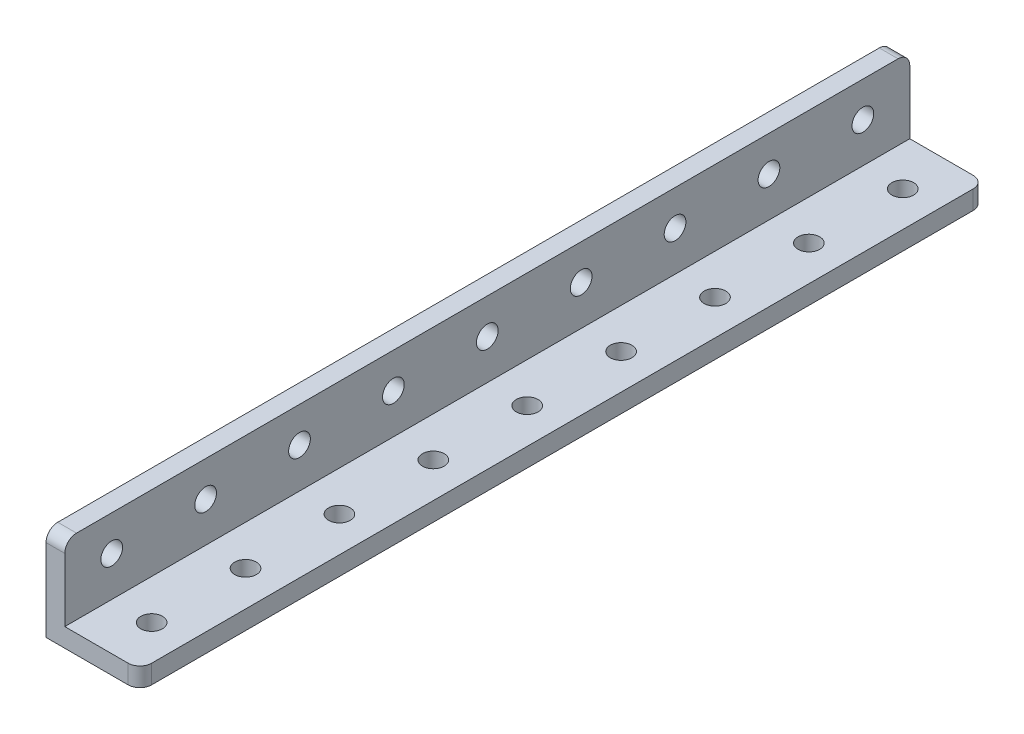
ISO-10303-21;
HEADER;
FILE_DESCRIPTION(('STEP AP214'),'2;1');
FILE_NAME('part.step','',(''),(''),'','','');
FILE_SCHEMA(('AUTOMOTIVE_DESIGN { 1 0 10303 214 1 1 1 1 }'));
ENDSEC;
DATA;
#1=APPLICATION_CONTEXT('core data for automotive mechanical design processes');
#2=APPLICATION_PROTOCOL_DEFINITION('international standard','automotive_design',2000,#1);
#3=PRODUCT_CONTEXT('',#1,'mechanical');
#4=PRODUCT('Part','Part','',(#3));
#5=PRODUCT_RELATED_PRODUCT_CATEGORY('part','',(#4));
#6=PRODUCT_DEFINITION_FORMATION('','',#4);
#7=PRODUCT_DEFINITION_CONTEXT('part definition',#1,'design');
#8=PRODUCT_DEFINITION('design','',#6,#7);
#9=PRODUCT_DEFINITION_SHAPE('','',#8);
#10=(LENGTH_UNIT() NAMED_UNIT(*) SI_UNIT(.MILLI.,.METRE.));
#11=(NAMED_UNIT(*) PLANE_ANGLE_UNIT() SI_UNIT($,.RADIAN.));
#12=(NAMED_UNIT(*) SI_UNIT($,.STERADIAN.) SOLID_ANGLE_UNIT());
#13=UNCERTAINTY_MEASURE_WITH_UNIT(LENGTH_MEASURE(1.E-05),#10,'distance_accuracy_value','');
#14=(GEOMETRIC_REPRESENTATION_CONTEXT(3) GLOBAL_UNCERTAINTY_ASSIGNED_CONTEXT((#13)) GLOBAL_UNIT_ASSIGNED_CONTEXT((#10,
#11,#12)) REPRESENTATION_CONTEXT('',''));
#15=CARTESIAN_POINT('',(0.,0.,0.));
#16=DIRECTION('',(0.,0.,1.));
#17=DIRECTION('',(1.,0.,0.));
#18=AXIS2_PLACEMENT_3D('',#15,#16,#17);
#19=CARTESIAN_POINT('',(0.,16.,-72.));
#20=DIRECTION('',(-1.,0.,0.));
#21=DIRECTION('',(0.,-1.,0.));
#22=AXIS2_PLACEMENT_3D('',#19,#20,#21);
#23=PLANE('',#22);
#24=CARTESIAN_POINT('',(0.,10.,48.));
#25=DIRECTION('',(-1.,0.,0.));
#26=DIRECTION('',(0.,-1.,0.));
#27=AXIS2_PLACEMENT_3D('',#24,#25,#26);
#28=CIRCLE('',#27,1.85000000000003);
#29=CARTESIAN_POINT('',(0.,8.14999999999997,48.));
#30=VERTEX_POINT('',#29);
#31=EDGE_CURVE('E556',#30,#30,#28,.T.);
#32=ORIENTED_EDGE('',*,*,#31,.F.);
#33=EDGE_LOOP('',(#32));
#34=FACE_BOUND('',#33,.T.);
#35=CARTESIAN_POINT('',(0.,10.,64.));
#36=DIRECTION('',(-1.,0.,0.));
#37=DIRECTION('',(0.,-1.,0.));
#38=AXIS2_PLACEMENT_3D('',#35,#36,#37);
#39=CIRCLE('',#38,1.85000000000003);
#40=CARTESIAN_POINT('',(0.,8.14999999999997,64.));
#41=VERTEX_POINT('',#40);
#42=EDGE_CURVE('E163',#41,#41,#39,.T.);
#43=ORIENTED_EDGE('',*,*,#42,.F.);
#44=EDGE_LOOP('',(#43));
#45=FACE_BOUND('',#44,.T.);
#46=DIRECTION('',(0.,0.,1.));
#47=VECTOR('',#46,1.);
#48=CARTESIAN_POINT('',(0.,16.,-72.));
#49=LINE('',#48,#47);
#50=CARTESIAN_POINT('',(0.,16.,-70.));
#51=VERTEX_POINT('',#50);
#52=CARTESIAN_POINT('',(0.,16.,70.));
#53=VERTEX_POINT('',#52);
#54=EDGE_CURVE('E148',#51,#53,#49,.T.);
#55=ORIENTED_EDGE('',*,*,#54,.F.);
#56=CARTESIAN_POINT('',(0.,14.,-70.));
#57=DIRECTION('',(-1.,0.,0.));
#58=DIRECTION('',(0.,-1.,0.));
#59=AXIS2_PLACEMENT_3D('',#56,#57,#58);
#60=CIRCLE('',#59,2.);
#61=CARTESIAN_POINT('',(0.,14.,-72.));
#62=VERTEX_POINT('',#61);
#63=EDGE_CURVE('E55',#51,#62,#60,.T.);
#64=ORIENTED_EDGE('',*,*,#63,.T.);
#65=DIRECTION('',(0.,-1.,0.));
#66=VECTOR('',#65,1.);
#67=CARTESIAN_POINT('',(0.,16.,-72.));
#68=LINE('',#67,#66);
#69=CARTESIAN_POINT('',(0.,0.,-72.));
#70=VERTEX_POINT('',#69);
#71=EDGE_CURVE('E109',#62,#70,#68,.T.);
#72=ORIENTED_EDGE('',*,*,#71,.T.);
#73=DIRECTION('',(0.,0.,1.));
#74=VECTOR('',#73,1.);
#75=CARTESIAN_POINT('',(0.,0.,-72.));
#76=LINE('',#75,#74);
#77=CARTESIAN_POINT('',(0.,0.,72.));
#78=VERTEX_POINT('',#77);
#79=EDGE_CURVE('E112',#70,#78,#76,.T.);
#80=ORIENTED_EDGE('',*,*,#79,.T.);
#81=DIRECTION('',(0.,-1.,0.));
#82=VECTOR('',#81,1.);
#83=CARTESIAN_POINT('',(0.,16.,72.));
#84=LINE('',#83,#82);
#85=CARTESIAN_POINT('',(0.,14.,72.));
#86=VERTEX_POINT('',#85);
#87=EDGE_CURVE('E140',#86,#78,#84,.T.);
#88=ORIENTED_EDGE('',*,*,#87,.F.);
#89=CARTESIAN_POINT('',(0.,14.,70.));
#90=DIRECTION('',(-1.,0.,0.));
#91=DIRECTION('',(0.,-1.,0.));
#92=AXIS2_PLACEMENT_3D('',#89,#90,#91);
#93=CIRCLE('',#92,2.);
#94=EDGE_CURVE('E47',#86,#53,#93,.T.);
#95=ORIENTED_EDGE('',*,*,#94,.T.);
#96=EDGE_LOOP('',(#55,#64,#72,#80,#88,#95));
#97=FACE_BOUND('',#96,.T.);
#98=CARTESIAN_POINT('',(0.,10.,32.));
#99=DIRECTION('',(-1.,0.,0.));
#100=DIRECTION('',(0.,-1.,0.));
#101=AXIS2_PLACEMENT_3D('',#98,#99,#100);
#102=CIRCLE('',#101,1.85000000000003);
#103=CARTESIAN_POINT('',(0.,8.14999999999997,32.));
#104=VERTEX_POINT('',#103);
#105=EDGE_CURVE('E166',#104,#104,#102,.T.);
#106=ORIENTED_EDGE('',*,*,#105,.F.);
#107=EDGE_LOOP('',(#106));
#108=FACE_BOUND('',#107,.T.);
#109=CARTESIAN_POINT('',(0.,10.,16.));
#110=DIRECTION('',(-1.,0.,0.));
#111=DIRECTION('',(0.,-1.,0.));
#112=AXIS2_PLACEMENT_3D('',#109,#110,#111);
#113=CIRCLE('',#112,1.85000000000003);
#114=CARTESIAN_POINT('',(0.,8.14999999999997,16.));
#115=VERTEX_POINT('',#114);
#116=EDGE_CURVE('E172',#115,#115,#113,.T.);
#117=ORIENTED_EDGE('',*,*,#116,.F.);
#118=EDGE_LOOP('',(#117));
#119=FACE_BOUND('',#118,.T.);
#120=CARTESIAN_POINT('',(0.,10.,0.));
#121=DIRECTION('',(-1.,0.,0.));
#122=DIRECTION('',(0.,-1.,0.));
#123=AXIS2_PLACEMENT_3D('',#120,#121,#122);
#124=CIRCLE('',#123,1.85000000000003);
#125=CARTESIAN_POINT('',(0.,8.14999999999997,0.));
#126=VERTEX_POINT('',#125);
#127=EDGE_CURVE('E178',#126,#126,#124,.T.);
#128=ORIENTED_EDGE('',*,*,#127,.F.);
#129=EDGE_LOOP('',(#128));
#130=FACE_BOUND('',#129,.T.);
#131=CARTESIAN_POINT('',(0.,10.,-16.));
#132=DIRECTION('',(-1.,0.,0.));
#133=DIRECTION('',(0.,-1.,0.));
#134=AXIS2_PLACEMENT_3D('',#131,#132,#133);
#135=CIRCLE('',#134,1.85000000000003);
#136=CARTESIAN_POINT('',(0.,8.14999999999997,-16.));
#137=VERTEX_POINT('',#136);
#138=EDGE_CURVE('E184',#137,#137,#135,.T.);
#139=ORIENTED_EDGE('',*,*,#138,.F.);
#140=EDGE_LOOP('',(#139));
#141=FACE_BOUND('',#140,.T.);
#142=CARTESIAN_POINT('',(0.,10.,-32.));
#143=DIRECTION('',(-1.,0.,0.));
#144=DIRECTION('',(0.,-1.,0.));
#145=AXIS2_PLACEMENT_3D('',#142,#143,#144);
#146=CIRCLE('',#145,1.85000000000003);
#147=CARTESIAN_POINT('',(0.,8.14999999999997,-32.));
#148=VERTEX_POINT('',#147);
#149=EDGE_CURVE('E190',#148,#148,#146,.T.);
#150=ORIENTED_EDGE('',*,*,#149,.F.);
#151=EDGE_LOOP('',(#150));
#152=FACE_BOUND('',#151,.T.);
#153=CARTESIAN_POINT('',(0.,10.,-48.));
#154=DIRECTION('',(-1.,0.,0.));
#155=DIRECTION('',(0.,-1.,0.));
#156=AXIS2_PLACEMENT_3D('',#153,#154,#155);
#157=CIRCLE('',#156,1.85000000000003);
#158=CARTESIAN_POINT('',(0.,8.14999999999997,-48.));
#159=VERTEX_POINT('',#158);
#160=EDGE_CURVE('E196',#159,#159,#157,.T.);
#161=ORIENTED_EDGE('',*,*,#160,.F.);
#162=EDGE_LOOP('',(#161));
#163=FACE_BOUND('',#162,.T.);
#164=CARTESIAN_POINT('',(0.,10.,-64.));
#165=DIRECTION('',(-1.,0.,0.));
#166=DIRECTION('',(0.,-1.,0.));
#167=AXIS2_PLACEMENT_3D('',#164,#165,#166);
#168=CIRCLE('',#167,1.85000000000003);
#169=CARTESIAN_POINT('',(0.,8.14999999999997,-64.));
#170=VERTEX_POINT('',#169);
#171=EDGE_CURVE('E202',#170,#170,#168,.T.);
#172=ORIENTED_EDGE('',*,*,#171,.F.);
#173=EDGE_LOOP('',(#172));
#174=FACE_BOUND('',#173,.T.);
#175=ADVANCED_FACE('F32',(#34,#45,#97,#108,#119,#130,#141,#152,#163,#174),#23,.T.);
#176=CARTESIAN_POINT('',(3.2,16.,-72.));
#177=DIRECTION('',(0.,1.,0.));
#178=DIRECTION('',(0.,0.,1.));
#179=AXIS2_PLACEMENT_3D('',#176,#177,#178);
#180=PLANE('',#179);
#181=DIRECTION('',(0.,0.,1.));
#182=VECTOR('',#181,1.);
#183=CARTESIAN_POINT('',(3.2,16.,-72.));
#184=LINE('',#183,#182);
#185=CARTESIAN_POINT('',(3.2,16.,-70.));
#186=VERTEX_POINT('',#185);
#187=CARTESIAN_POINT('',(3.2,16.,70.));
#188=VERTEX_POINT('',#187);
#189=EDGE_CURVE('E151',#186,#188,#184,.T.);
#190=ORIENTED_EDGE('',*,*,#189,.F.);
#191=DIRECTION('',(-1.,0.,0.));
#192=VECTOR('',#191,1.);
#193=CARTESIAN_POINT('',(3.2,16.,-70.));
#194=LINE('',#193,#192);
#195=EDGE_CURVE('E229',#186,#51,#194,.T.);
#196=ORIENTED_EDGE('',*,*,#195,.T.);
#197=ORIENTED_EDGE('',*,*,#54,.T.);
#198=DIRECTION('',(-1.,0.,0.));
#199=VECTOR('',#198,1.);
#200=CARTESIAN_POINT('',(3.2,16.,70.));
#201=LINE('',#200,#199);
#202=EDGE_CURVE('E227',#53,#188,#201,.F.);
#203=ORIENTED_EDGE('',*,*,#202,.T.);
#204=EDGE_LOOP('',(#190,#196,#197,#203));
#205=FACE_BOUND('',#204,.T.);
#206=ADVANCED_FACE('F246',(#205),#180,.T.);
#207=CARTESIAN_POINT('',(3.2,3.2,-72.));
#208=DIRECTION('',(1.,0.,0.));
#209=DIRECTION('',(0.,0.,-1.));
#210=AXIS2_PLACEMENT_3D('',#207,#208,#209);
#211=PLANE('',#210);
#212=CARTESIAN_POINT('',(3.2,10.,48.));
#213=DIRECTION('',(1.,0.,0.));
#214=DIRECTION('',(0.,0.,-1.));
#215=AXIS2_PLACEMENT_3D('',#212,#213,#214);
#216=CIRCLE('',#215,1.85000000000003);
#217=CARTESIAN_POINT('',(3.2,10.,46.15));
#218=VERTEX_POINT('',#217);
#219=EDGE_CURVE('E560',#218,#218,#216,.T.);
#220=ORIENTED_EDGE('',*,*,#219,.F.);
#221=EDGE_LOOP('',(#220));
#222=FACE_BOUND('',#221,.T.);
#223=CARTESIAN_POINT('',(3.2,10.,64.));
#224=DIRECTION('',(1.,0.,0.));
#225=DIRECTION('',(0.,0.,-1.));
#226=AXIS2_PLACEMENT_3D('',#223,#224,#225);
#227=CIRCLE('',#226,1.85000000000003);
#228=CARTESIAN_POINT('',(3.2,10.,62.15));
#229=VERTEX_POINT('',#228);
#230=EDGE_CURVE('E142',#229,#229,#227,.T.);
#231=ORIENTED_EDGE('',*,*,#230,.F.);
#232=EDGE_LOOP('',(#231));
#233=FACE_BOUND('',#232,.T.);
#234=DIRECTION('',(0.,1.,0.));
#235=VECTOR('',#234,1.);
#236=CARTESIAN_POINT('',(3.2,3.2,-72.));
#237=LINE('',#236,#235);
#238=CARTESIAN_POINT('',(3.2,3.2,-72.));
#239=VERTEX_POINT('',#238);
#240=CARTESIAN_POINT('',(3.2,14.,-72.));
#241=VERTEX_POINT('',#240);
#242=EDGE_CURVE('E127',#239,#241,#237,.T.);
#243=ORIENTED_EDGE('',*,*,#242,.T.);
#244=CARTESIAN_POINT('',(3.2,14.,-70.));
#245=DIRECTION('',(1.,0.,0.));
#246=DIRECTION('',(0.,0.,-1.));
#247=AXIS2_PLACEMENT_3D('',#244,#245,#246);
#248=CIRCLE('',#247,2.);
#249=EDGE_CURVE('E11',#241,#186,#248,.T.);
#250=ORIENTED_EDGE('',*,*,#249,.T.);
#251=ORIENTED_EDGE('',*,*,#189,.T.);
#252=CARTESIAN_POINT('',(3.2,14.,70.));
#253=DIRECTION('',(1.,0.,0.));
#254=DIRECTION('',(0.,0.,-1.));
#255=AXIS2_PLACEMENT_3D('',#252,#253,#254);
#256=CIRCLE('',#255,2.);
#257=CARTESIAN_POINT('',(3.2,14.,72.));
#258=VERTEX_POINT('',#257);
#259=EDGE_CURVE('E40',#188,#258,#256,.T.);
#260=ORIENTED_EDGE('',*,*,#259,.T.);
#261=DIRECTION('',(0.,1.,0.));
#262=VECTOR('',#261,1.);
#263=CARTESIAN_POINT('',(3.2,3.2,72.));
#264=LINE('',#263,#262);
#265=CARTESIAN_POINT('',(3.2,3.2,72.));
#266=VERTEX_POINT('',#265);
#267=EDGE_CURVE('E117',#266,#258,#264,.T.);
#268=ORIENTED_EDGE('',*,*,#267,.F.);
#269=DIRECTION('',(0.,0.,1.));
#270=VECTOR('',#269,1.);
#271=CARTESIAN_POINT('',(3.2,3.2,-72.));
#272=LINE('',#271,#270);
#273=EDGE_CURVE('E154',#239,#266,#272,.T.);
#274=ORIENTED_EDGE('',*,*,#273,.F.);
#275=EDGE_LOOP('',(#243,#250,#251,#260,#268,#274));
#276=FACE_BOUND('',#275,.T.);
#277=CARTESIAN_POINT('',(3.2,10.,32.));
#278=DIRECTION('',(1.,0.,0.));
#279=DIRECTION('',(0.,0.,-1.));
#280=AXIS2_PLACEMENT_3D('',#277,#278,#279);
#281=CIRCLE('',#280,1.85000000000003);
#282=CARTESIAN_POINT('',(3.2,10.,30.15));
#283=VERTEX_POINT('',#282);
#284=EDGE_CURVE('E150',#283,#283,#281,.T.);
#285=ORIENTED_EDGE('',*,*,#284,.F.);
#286=EDGE_LOOP('',(#285));
#287=FACE_BOUND('',#286,.T.);
#288=CARTESIAN_POINT('',(3.2,10.,16.));
#289=DIRECTION('',(1.,0.,0.));
#290=DIRECTION('',(0.,0.,-1.));
#291=AXIS2_PLACEMENT_3D('',#288,#289,#290);
#292=CIRCLE('',#291,1.85000000000003);
#293=CARTESIAN_POINT('',(3.2,10.,14.15));
#294=VERTEX_POINT('',#293);
#295=EDGE_CURVE('E169',#294,#294,#292,.T.);
#296=ORIENTED_EDGE('',*,*,#295,.F.);
#297=EDGE_LOOP('',(#296));
#298=FACE_BOUND('',#297,.T.);
#299=CARTESIAN_POINT('',(3.2,10.,0.));
#300=DIRECTION('',(1.,0.,0.));
#301=DIRECTION('',(0.,0.,-1.));
#302=AXIS2_PLACEMENT_3D('',#299,#300,#301);
#303=CIRCLE('',#302,1.85000000000003);
#304=CARTESIAN_POINT('',(3.2,10.,-1.85000000000002));
#305=VERTEX_POINT('',#304);
#306=EDGE_CURVE('E175',#305,#305,#303,.T.);
#307=ORIENTED_EDGE('',*,*,#306,.F.);
#308=EDGE_LOOP('',(#307));
#309=FACE_BOUND('',#308,.T.);
#310=CARTESIAN_POINT('',(3.2,10.,-16.));
#311=DIRECTION('',(1.,0.,0.));
#312=DIRECTION('',(0.,0.,-1.));
#313=AXIS2_PLACEMENT_3D('',#310,#311,#312);
#314=CIRCLE('',#313,1.85000000000003);
#315=CARTESIAN_POINT('',(3.2,10.,-17.85));
#316=VERTEX_POINT('',#315);
#317=EDGE_CURVE('E181',#316,#316,#314,.T.);
#318=ORIENTED_EDGE('',*,*,#317,.F.);
#319=EDGE_LOOP('',(#318));
#320=FACE_BOUND('',#319,.T.);
#321=CARTESIAN_POINT('',(3.2,10.,-32.));
#322=DIRECTION('',(1.,0.,0.));
#323=DIRECTION('',(0.,0.,-1.));
#324=AXIS2_PLACEMENT_3D('',#321,#322,#323);
#325=CIRCLE('',#324,1.85000000000003);
#326=CARTESIAN_POINT('',(3.2,10.,-33.85));
#327=VERTEX_POINT('',#326);
#328=EDGE_CURVE('E187',#327,#327,#325,.T.);
#329=ORIENTED_EDGE('',*,*,#328,.F.);
#330=EDGE_LOOP('',(#329));
#331=FACE_BOUND('',#330,.T.);
#332=CARTESIAN_POINT('',(3.2,10.,-48.));
#333=DIRECTION('',(1.,0.,0.));
#334=DIRECTION('',(0.,0.,-1.));
#335=AXIS2_PLACEMENT_3D('',#332,#333,#334);
#336=CIRCLE('',#335,1.85000000000003);
#337=CARTESIAN_POINT('',(3.2,10.,-49.85));
#338=VERTEX_POINT('',#337);
#339=EDGE_CURVE('E193',#338,#338,#336,.T.);
#340=ORIENTED_EDGE('',*,*,#339,.F.);
#341=EDGE_LOOP('',(#340));
#342=FACE_BOUND('',#341,.T.);
#343=CARTESIAN_POINT('',(3.2,10.,-64.));
#344=DIRECTION('',(1.,0.,0.));
#345=DIRECTION('',(0.,0.,-1.));
#346=AXIS2_PLACEMENT_3D('',#343,#344,#345);
#347=CIRCLE('',#346,1.85000000000003);
#348=CARTESIAN_POINT('',(3.2,10.,-65.85));
#349=VERTEX_POINT('',#348);
#350=EDGE_CURVE('E199',#349,#349,#347,.T.);
#351=ORIENTED_EDGE('',*,*,#350,.F.);
#352=EDGE_LOOP('',(#351));
#353=FACE_BOUND('',#352,.T.);
#354=ADVANCED_FACE('F235',(#222,#233,#276,#287,#298,#309,#320,#331,#342,#353),#211,.T.);
#355=CARTESIAN_POINT('',(16.,3.2,-72.));
#356=DIRECTION('',(0.,1.,0.));
#357=DIRECTION('',(-1.,0.,0.));
#358=AXIS2_PLACEMENT_3D('',#355,#356,#357);
#359=PLANE('',#358);
#360=CARTESIAN_POINT('',(10.,3.2,-64.));
#361=DIRECTION('',(0.,1.,0.));
#362=DIRECTION('',(-1.,0.,0.));
#363=AXIS2_PLACEMENT_3D('',#360,#361,#362);
#364=CIRCLE('',#363,1.85);
#365=CARTESIAN_POINT('',(8.15,3.2,-64.));
#366=VERTEX_POINT('',#365);
#367=EDGE_CURVE('E603',#366,#366,#364,.T.);
#368=ORIENTED_EDGE('',*,*,#367,.F.);
#369=EDGE_LOOP('',(#368));
#370=FACE_BOUND('',#369,.T.);
#371=CARTESIAN_POINT('',(10.,3.2,-48.));
#372=DIRECTION('',(0.,1.,0.));
#373=DIRECTION('',(-1.,0.,0.));
#374=AXIS2_PLACEMENT_3D('',#371,#372,#373);
#375=CIRCLE('',#374,1.85);
#376=CARTESIAN_POINT('',(8.15,3.2,-48.));
#377=VERTEX_POINT('',#376);
#378=EDGE_CURVE('E597',#377,#377,#375,.T.);
#379=ORIENTED_EDGE('',*,*,#378,.F.);
#380=EDGE_LOOP('',(#379));
#381=FACE_BOUND('',#380,.T.);
#382=CARTESIAN_POINT('',(10.,3.2,-32.));
#383=DIRECTION('',(0.,1.,0.));
#384=DIRECTION('',(-1.,0.,0.));
#385=AXIS2_PLACEMENT_3D('',#382,#383,#384);
#386=CIRCLE('',#385,1.85);
#387=CARTESIAN_POINT('',(8.15,3.2,-32.));
#388=VERTEX_POINT('',#387);
#389=EDGE_CURVE('E591',#388,#388,#386,.T.);
#390=ORIENTED_EDGE('',*,*,#389,.F.);
#391=EDGE_LOOP('',(#390));
#392=FACE_BOUND('',#391,.T.);
#393=CARTESIAN_POINT('',(10.,3.2,-16.));
#394=DIRECTION('',(0.,1.,0.));
#395=DIRECTION('',(-1.,0.,0.));
#396=AXIS2_PLACEMENT_3D('',#393,#394,#395);
#397=CIRCLE('',#396,1.85);
#398=CARTESIAN_POINT('',(8.15,3.2,-16.));
#399=VERTEX_POINT('',#398);
#400=EDGE_CURVE('E585',#399,#399,#397,.T.);
#401=ORIENTED_EDGE('',*,*,#400,.F.);
#402=EDGE_LOOP('',(#401));
#403=FACE_BOUND('',#402,.T.);
#404=CARTESIAN_POINT('',(10.,3.2,0.));
#405=DIRECTION('',(0.,1.,0.));
#406=DIRECTION('',(-1.,0.,0.));
#407=AXIS2_PLACEMENT_3D('',#404,#405,#406);
#408=CIRCLE('',#407,1.85);
#409=CARTESIAN_POINT('',(8.15,3.2,0.));
#410=VERTEX_POINT('',#409);
#411=EDGE_CURVE('E579',#410,#410,#408,.T.);
#412=ORIENTED_EDGE('',*,*,#411,.F.);
#413=EDGE_LOOP('',(#412));
#414=FACE_BOUND('',#413,.T.);
#415=CARTESIAN_POINT('',(10.,3.2,16.));
#416=DIRECTION('',(0.,1.,0.));
#417=DIRECTION('',(-1.,0.,0.));
#418=AXIS2_PLACEMENT_3D('',#415,#416,#417);
#419=CIRCLE('',#418,1.85);
#420=CARTESIAN_POINT('',(8.15,3.2,16.));
#421=VERTEX_POINT('',#420);
#422=EDGE_CURVE('E573',#421,#421,#419,.T.);
#423=ORIENTED_EDGE('',*,*,#422,.F.);
#424=EDGE_LOOP('',(#423));
#425=FACE_BOUND('',#424,.T.);
#426=CARTESIAN_POINT('',(10.,3.2,32.));
#427=DIRECTION('',(0.,1.,0.));
#428=DIRECTION('',(-1.,0.,0.));
#429=AXIS2_PLACEMENT_3D('',#426,#427,#428);
#430=CIRCLE('',#429,1.85);
#431=CARTESIAN_POINT('',(8.15,3.2,32.));
#432=VERTEX_POINT('',#431);
#433=EDGE_CURVE('E567',#432,#432,#430,.T.);
#434=ORIENTED_EDGE('',*,*,#433,.F.);
#435=EDGE_LOOP('',(#434));
#436=FACE_BOUND('',#435,.T.);
#437=CARTESIAN_POINT('',(10.,3.2,48.));
#438=DIRECTION('',(0.,1.,0.));
#439=DIRECTION('',(-1.,0.,0.));
#440=AXIS2_PLACEMENT_3D('',#437,#438,#439);
#441=CIRCLE('',#440,1.85);
#442=CARTESIAN_POINT('',(8.15,3.2,48.));
#443=VERTEX_POINT('',#442);
#444=EDGE_CURVE('E563',#443,#443,#441,.T.);
#445=ORIENTED_EDGE('',*,*,#444,.F.);
#446=EDGE_LOOP('',(#445));
#447=FACE_BOUND('',#446,.T.);
#448=CARTESIAN_POINT('',(10.,3.2,64.));
#449=DIRECTION('',(0.,1.,0.));
#450=DIRECTION('',(-1.,0.,0.));
#451=AXIS2_PLACEMENT_3D('',#448,#449,#450);
#452=CIRCLE('',#451,1.85);
#453=CARTESIAN_POINT('',(8.15,3.2,64.));
#454=VERTEX_POINT('',#453);
#455=EDGE_CURVE('E550',#454,#454,#452,.T.);
#456=ORIENTED_EDGE('',*,*,#455,.F.);
#457=EDGE_LOOP('',(#456));
#458=FACE_BOUND('',#457,.T.);
#459=DIRECTION('',(-1.,0.,0.));
#460=VECTOR('',#459,1.);
#461=CARTESIAN_POINT('',(16.,3.2,72.));
#462=LINE('',#461,#460);
#463=CARTESIAN_POINT('',(14.,3.2,72.));
#464=VERTEX_POINT('',#463);
#465=EDGE_CURVE('E144',#464,#266,#462,.T.);
#466=ORIENTED_EDGE('',*,*,#465,.F.);
#467=CARTESIAN_POINT('',(14.,3.2,70.));
#468=DIRECTION('',(0.,1.,0.));
#469=DIRECTION('',(-1.,0.,0.));
#470=AXIS2_PLACEMENT_3D('',#467,#468,#469);
#471=CIRCLE('',#470,2.);
#472=CARTESIAN_POINT('',(16.,3.2,70.));
#473=VERTEX_POINT('',#472);
#474=EDGE_CURVE('E213',#464,#473,#471,.T.);
#475=ORIENTED_EDGE('',*,*,#474,.T.);
#476=DIRECTION('',(0.,0.,1.));
#477=VECTOR('',#476,1.);
#478=CARTESIAN_POINT('',(16.,3.2,-72.));
#479=LINE('',#478,#477);
#480=CARTESIAN_POINT('',(16.,3.2,-70.));
#481=VERTEX_POINT('',#480);
#482=EDGE_CURVE('E157',#481,#473,#479,.T.);
#483=ORIENTED_EDGE('',*,*,#482,.F.);
#484=CARTESIAN_POINT('',(14.,3.2,-70.));
#485=DIRECTION('',(0.,1.,0.));
#486=DIRECTION('',(-1.,0.,0.));
#487=AXIS2_PLACEMENT_3D('',#484,#485,#486);
#488=CIRCLE('',#487,2.);
#489=CARTESIAN_POINT('',(14.,3.2,-72.));
#490=VERTEX_POINT('',#489);
#491=EDGE_CURVE('E211',#481,#490,#488,.T.);
#492=ORIENTED_EDGE('',*,*,#491,.T.);
#493=DIRECTION('',(-1.,0.,0.));
#494=VECTOR('',#493,1.);
#495=CARTESIAN_POINT('',(16.,3.2,-72.));
#496=LINE('',#495,#494);
#497=EDGE_CURVE('E133',#490,#239,#496,.T.);
#498=ORIENTED_EDGE('',*,*,#497,.T.);
#499=ORIENTED_EDGE('',*,*,#273,.T.);
#500=EDGE_LOOP('',(#466,#475,#483,#492,#498,#499));
#501=FACE_BOUND('',#500,.T.);
#502=ADVANCED_FACE('F263',(#370,#381,#392,#403,#414,#425,#436,#447,#458,#501),#359,.T.);
#503=CARTESIAN_POINT('',(16.,0.,-72.));
#504=DIRECTION('',(1.,0.,0.));
#505=DIRECTION('',(0.,0.,-1.));
#506=AXIS2_PLACEMENT_3D('',#503,#504,#505);
#507=PLANE('',#506);
#508=ORIENTED_EDGE('',*,*,#482,.T.);
#509=DIRECTION('',(0.,1.,0.));
#510=VECTOR('',#509,1.);
#511=CARTESIAN_POINT('',(16.,0.,70.));
#512=LINE('',#511,#510);
#513=CARTESIAN_POINT('',(16.,0.,70.));
#514=VERTEX_POINT('',#513);
#515=EDGE_CURVE('E218',#473,#514,#512,.F.);
#516=ORIENTED_EDGE('',*,*,#515,.T.);
#517=DIRECTION('',(0.,0.,1.));
#518=VECTOR('',#517,1.);
#519=CARTESIAN_POINT('',(16.,0.,-72.));
#520=LINE('',#519,#518);
#521=CARTESIAN_POINT('',(16.,0.,-70.));
#522=VERTEX_POINT('',#521);
#523=EDGE_CURVE('E126',#522,#514,#520,.T.);
#524=ORIENTED_EDGE('',*,*,#523,.F.);
#525=DIRECTION('',(0.,1.,0.));
#526=VECTOR('',#525,1.);
#527=CARTESIAN_POINT('',(16.,0.,-70.));
#528=LINE('',#527,#526);
#529=EDGE_CURVE('E215',#522,#481,#528,.T.);
#530=ORIENTED_EDGE('',*,*,#529,.T.);
#531=EDGE_LOOP('',(#508,#516,#524,#530));
#532=FACE_BOUND('',#531,.T.);
#533=ADVANCED_FACE('F257',(#532),#507,.T.);
#534=CARTESIAN_POINT('',(0.,0.,-72.));
#535=DIRECTION('',(0.,-1.,0.));
#536=DIRECTION('',(0.,0.,-1.));
#537=AXIS2_PLACEMENT_3D('',#534,#535,#536);
#538=PLANE('',#537);
#539=CARTESIAN_POINT('',(10.,0.,-64.));
#540=DIRECTION('',(0.,-1.,0.));
#541=DIRECTION('',(0.,0.,-1.));
#542=AXIS2_PLACEMENT_3D('',#539,#540,#541);
#543=CIRCLE('',#542,1.85);
#544=CARTESIAN_POINT('',(10.,0.,-65.85));
#545=VERTEX_POINT('',#544);
#546=EDGE_CURVE('E606',#545,#545,#543,.F.);
#547=ORIENTED_EDGE('',*,*,#546,.T.);
#548=EDGE_LOOP('',(#547));
#549=FACE_BOUND('',#548,.T.);
#550=CARTESIAN_POINT('',(10.,0.,-48.));
#551=DIRECTION('',(0.,-1.,0.));
#552=DIRECTION('',(0.,0.,-1.));
#553=AXIS2_PLACEMENT_3D('',#550,#551,#552);
#554=CIRCLE('',#553,1.85);
#555=CARTESIAN_POINT('',(10.,0.,-49.85));
#556=VERTEX_POINT('',#555);
#557=EDGE_CURVE('E600',#556,#556,#554,.F.);
#558=ORIENTED_EDGE('',*,*,#557,.T.);
#559=EDGE_LOOP('',(#558));
#560=FACE_BOUND('',#559,.T.);
#561=CARTESIAN_POINT('',(10.,0.,-32.));
#562=DIRECTION('',(0.,-1.,0.));
#563=DIRECTION('',(0.,0.,-1.));
#564=AXIS2_PLACEMENT_3D('',#561,#562,#563);
#565=CIRCLE('',#564,1.85);
#566=CARTESIAN_POINT('',(10.,0.,-33.85));
#567=VERTEX_POINT('',#566);
#568=EDGE_CURVE('E594',#567,#567,#565,.F.);
#569=ORIENTED_EDGE('',*,*,#568,.T.);
#570=EDGE_LOOP('',(#569));
#571=FACE_BOUND('',#570,.T.);
#572=CARTESIAN_POINT('',(10.,0.,-16.));
#573=DIRECTION('',(0.,-1.,0.));
#574=DIRECTION('',(0.,0.,-1.));
#575=AXIS2_PLACEMENT_3D('',#572,#573,#574);
#576=CIRCLE('',#575,1.85);
#577=CARTESIAN_POINT('',(10.,0.,-17.85));
#578=VERTEX_POINT('',#577);
#579=EDGE_CURVE('E588',#578,#578,#576,.F.);
#580=ORIENTED_EDGE('',*,*,#579,.T.);
#581=EDGE_LOOP('',(#580));
#582=FACE_BOUND('',#581,.T.);
#583=CARTESIAN_POINT('',(10.,0.,0.));
#584=DIRECTION('',(0.,-1.,0.));
#585=DIRECTION('',(0.,0.,-1.));
#586=AXIS2_PLACEMENT_3D('',#583,#584,#585);
#587=CIRCLE('',#586,1.85);
#588=CARTESIAN_POINT('',(10.,0.,-1.84999999999999));
#589=VERTEX_POINT('',#588);
#590=EDGE_CURVE('E582',#589,#589,#587,.F.);
#591=ORIENTED_EDGE('',*,*,#590,.T.);
#592=EDGE_LOOP('',(#591));
#593=FACE_BOUND('',#592,.T.);
#594=CARTESIAN_POINT('',(10.,0.,16.));
#595=DIRECTION('',(0.,-1.,0.));
#596=DIRECTION('',(0.,0.,-1.));
#597=AXIS2_PLACEMENT_3D('',#594,#595,#596);
#598=CIRCLE('',#597,1.85);
#599=CARTESIAN_POINT('',(10.,0.,14.15));
#600=VERTEX_POINT('',#599);
#601=EDGE_CURVE('E576',#600,#600,#598,.F.);
#602=ORIENTED_EDGE('',*,*,#601,.T.);
#603=EDGE_LOOP('',(#602));
#604=FACE_BOUND('',#603,.T.);
#605=CARTESIAN_POINT('',(10.,0.,32.));
#606=DIRECTION('',(0.,-1.,0.));
#607=DIRECTION('',(0.,0.,-1.));
#608=AXIS2_PLACEMENT_3D('',#605,#606,#607);
#609=CIRCLE('',#608,1.85);
#610=CARTESIAN_POINT('',(10.,0.,30.15));
#611=VERTEX_POINT('',#610);
#612=EDGE_CURVE('E570',#611,#611,#609,.F.);
#613=ORIENTED_EDGE('',*,*,#612,.T.);
#614=EDGE_LOOP('',(#613));
#615=FACE_BOUND('',#614,.T.);
#616=CARTESIAN_POINT('',(10.,0.,48.));
#617=DIRECTION('',(0.,-1.,0.));
#618=DIRECTION('',(0.,0.,-1.));
#619=AXIS2_PLACEMENT_3D('',#616,#617,#618);
#620=CIRCLE('',#619,1.85);
#621=CARTESIAN_POINT('',(10.,0.,46.15));
#622=VERTEX_POINT('',#621);
#623=EDGE_CURVE('E564',#622,#622,#620,.F.);
#624=ORIENTED_EDGE('',*,*,#623,.T.);
#625=EDGE_LOOP('',(#624));
#626=FACE_BOUND('',#625,.T.);
#627=CARTESIAN_POINT('',(10.,0.,64.));
#628=DIRECTION('',(0.,-1.,0.));
#629=DIRECTION('',(0.,0.,-1.));
#630=AXIS2_PLACEMENT_3D('',#627,#628,#629);
#631=CIRCLE('',#630,1.85);
#632=CARTESIAN_POINT('',(10.,0.,62.15));
#633=VERTEX_POINT('',#632);
#634=EDGE_CURVE('E552',#633,#633,#631,.F.);
#635=ORIENTED_EDGE('',*,*,#634,.T.);
#636=EDGE_LOOP('',(#635));
#637=FACE_BOUND('',#636,.T.);
#638=ORIENTED_EDGE('',*,*,#523,.T.);
#639=CARTESIAN_POINT('',(14.,0.,70.));
#640=DIRECTION('',(0.,-1.,0.));
#641=DIRECTION('',(0.,0.,-1.));
#642=AXIS2_PLACEMENT_3D('',#639,#640,#641);
#643=CIRCLE('',#642,2.);
#644=CARTESIAN_POINT('',(14.,0.,72.));
#645=VERTEX_POINT('',#644);
#646=EDGE_CURVE('E222',#514,#645,#643,.T.);
#647=ORIENTED_EDGE('',*,*,#646,.T.);
#648=DIRECTION('',(1.,0.,0.));
#649=VECTOR('',#648,1.);
#650=CARTESIAN_POINT('',(0.,0.,72.));
#651=LINE('',#650,#649);
#652=EDGE_CURVE('E125',#78,#645,#651,.T.);
#653=ORIENTED_EDGE('',*,*,#652,.F.);
#654=ORIENTED_EDGE('',*,*,#79,.F.);
#655=DIRECTION('',(1.,0.,0.));
#656=VECTOR('',#655,1.);
#657=CARTESIAN_POINT('',(0.,0.,-72.));
#658=LINE('',#657,#656);
#659=CARTESIAN_POINT('',(14.,0.,-72.));
#660=VERTEX_POINT('',#659);
#661=EDGE_CURVE('E116',#70,#660,#658,.T.);
#662=ORIENTED_EDGE('',*,*,#661,.T.);
#663=CARTESIAN_POINT('',(14.,0.,-70.));
#664=DIRECTION('',(0.,-1.,0.));
#665=DIRECTION('',(0.,0.,-1.));
#666=AXIS2_PLACEMENT_3D('',#663,#664,#665);
#667=CIRCLE('',#666,2.);
#668=EDGE_CURVE('E220',#660,#522,#667,.T.);
#669=ORIENTED_EDGE('',*,*,#668,.T.);
#670=EDGE_LOOP('',(#638,#647,#653,#654,#662,#669));
#671=FACE_BOUND('',#670,.T.);
#672=ADVANCED_FACE('F122',(#549,#560,#571,#582,#593,#604,#615,#626,#637,#671),#538,.T.);
#673=CARTESIAN_POINT('',(0.,16.,-72.));
#674=DIRECTION('',(0.,0.,-1.));
#675=DIRECTION('',(-1.,0.,0.));
#676=AXIS2_PLACEMENT_3D('',#673,#674,#675);
#677=PLANE('',#676);
#678=ORIENTED_EDGE('',*,*,#497,.F.);
#679=DIRECTION('',(0.,1.,0.));
#680=VECTOR('',#679,1.);
#681=CARTESIAN_POINT('',(14.,16.,-72.));
#682=LINE('',#681,#680);
#683=EDGE_CURVE('E132',#490,#660,#682,.F.);
#684=ORIENTED_EDGE('',*,*,#683,.T.);
#685=ORIENTED_EDGE('',*,*,#661,.F.);
#686=ORIENTED_EDGE('',*,*,#71,.F.);
#687=DIRECTION('',(-1.,0.,0.));
#688=VECTOR('',#687,1.);
#689=CARTESIAN_POINT('',(0.,14.,-72.));
#690=LINE('',#689,#688);
#691=EDGE_CURVE('E224',#62,#241,#690,.F.);
#692=ORIENTED_EDGE('',*,*,#691,.T.);
#693=ORIENTED_EDGE('',*,*,#242,.F.);
#694=EDGE_LOOP('',(#678,#684,#685,#686,#692,#693));
#695=FACE_BOUND('',#694,.T.);
#696=ADVANCED_FACE('F130',(#695),#677,.T.);
#697=CARTESIAN_POINT('',(0.,16.,72.));
#698=DIRECTION('',(0.,0.,-1.));
#699=DIRECTION('',(-1.,0.,0.));
#700=AXIS2_PLACEMENT_3D('',#697,#698,#699);
#701=PLANE('',#700);
#702=ORIENTED_EDGE('',*,*,#652,.T.);
#703=DIRECTION('',(0.,1.,0.));
#704=VECTOR('',#703,1.);
#705=CARTESIAN_POINT('',(14.,3.2,72.));
#706=LINE('',#705,#704);
#707=EDGE_CURVE('E208',#645,#464,#706,.T.);
#708=ORIENTED_EDGE('',*,*,#707,.T.);
#709=ORIENTED_EDGE('',*,*,#465,.T.);
#710=ORIENTED_EDGE('',*,*,#267,.T.);
#711=DIRECTION('',(-1.,0.,0.));
#712=VECTOR('',#711,1.);
#713=CARTESIAN_POINT('',(0.,14.,72.));
#714=LINE('',#713,#712);
#715=EDGE_CURVE('E205',#258,#86,#714,.T.);
#716=ORIENTED_EDGE('',*,*,#715,.T.);
#717=ORIENTED_EDGE('',*,*,#87,.T.);
#718=EDGE_LOOP('',(#702,#708,#709,#710,#716,#717));
#719=FACE_BOUND('',#718,.T.);
#720=ADVANCED_FACE('F243',(#719),#701,.F.);
#721=CARTESIAN_POINT('',(16.,10.,64.));
#722=DIRECTION('',(-1.,0.,0.));
#723=DIRECTION('',(0.,-1.,0.));
#724=AXIS2_PLACEMENT_3D('',#721,#722,#723);
#725=CYLINDRICAL_SURFACE('',#724,1.85000000000003);
#726=ORIENTED_EDGE('',*,*,#230,.T.);
#727=EDGE_LOOP('',(#726));
#728=FACE_BOUND('',#727,.T.);
#729=ORIENTED_EDGE('',*,*,#42,.T.);
#730=EDGE_LOOP('',(#729));
#731=FACE_BOUND('',#730,.T.);
#732=ADVANCED_FACE('F354',(#728,#731),#725,.F.);
#733=CARTESIAN_POINT('',(10.,-0.00100000000000057,64.));
#734=DIRECTION('',(0.,1.,0.));
#735=DIRECTION('',(-1.,0.,0.));
#736=AXIS2_PLACEMENT_3D('',#733,#734,#735);
#737=CYLINDRICAL_SURFACE('',#736,1.85);
#738=ORIENTED_EDGE('',*,*,#634,.F.);
#739=EDGE_LOOP('',(#738));
#740=FACE_BOUND('',#739,.T.);
#741=ORIENTED_EDGE('',*,*,#455,.T.);
#742=EDGE_LOOP('',(#741));
#743=FACE_BOUND('',#742,.T.);
#744=ADVANCED_FACE('F525',(#740,#743),#737,.F.);
#745=CARTESIAN_POINT('',(16.,10.,48.));
#746=DIRECTION('',(-1.,0.,0.));
#747=DIRECTION('',(0.,-1.,0.));
#748=AXIS2_PLACEMENT_3D('',#745,#746,#747);
#749=CYLINDRICAL_SURFACE('',#748,1.85000000000003);
#750=ORIENTED_EDGE('',*,*,#219,.T.);
#751=EDGE_LOOP('',(#750));
#752=FACE_BOUND('',#751,.T.);
#753=ORIENTED_EDGE('',*,*,#31,.T.);
#754=EDGE_LOOP('',(#753));
#755=FACE_BOUND('',#754,.T.);
#756=ADVANCED_FACE('F291',(#752,#755),#749,.F.);
#757=CARTESIAN_POINT('',(16.,10.,32.));
#758=DIRECTION('',(-1.,0.,0.));
#759=DIRECTION('',(0.,-1.,0.));
#760=AXIS2_PLACEMENT_3D('',#757,#758,#759);
#761=CYLINDRICAL_SURFACE('',#760,1.85000000000003);
#762=ORIENTED_EDGE('',*,*,#284,.T.);
#763=EDGE_LOOP('',(#762));
#764=FACE_BOUND('',#763,.T.);
#765=ORIENTED_EDGE('',*,*,#105,.T.);
#766=EDGE_LOOP('',(#765));
#767=FACE_BOUND('',#766,.T.);
#768=ADVANCED_FACE('F287',(#764,#767),#761,.F.);
#769=CARTESIAN_POINT('',(16.,10.,16.));
#770=DIRECTION('',(-1.,0.,0.));
#771=DIRECTION('',(0.,-1.,0.));
#772=AXIS2_PLACEMENT_3D('',#769,#770,#771);
#773=CYLINDRICAL_SURFACE('',#772,1.85000000000003);
#774=ORIENTED_EDGE('',*,*,#295,.T.);
#775=EDGE_LOOP('',(#774));
#776=FACE_BOUND('',#775,.T.);
#777=ORIENTED_EDGE('',*,*,#116,.T.);
#778=EDGE_LOOP('',(#777));
#779=FACE_BOUND('',#778,.T.);
#780=ADVANCED_FACE('F290',(#776,#779),#773,.F.);
#781=CARTESIAN_POINT('',(16.,10.,0.));
#782=DIRECTION('',(-1.,0.,0.));
#783=DIRECTION('',(0.,-1.,0.));
#784=AXIS2_PLACEMENT_3D('',#781,#782,#783);
#785=CYLINDRICAL_SURFACE('',#784,1.85000000000003);
#786=ORIENTED_EDGE('',*,*,#306,.T.);
#787=EDGE_LOOP('',(#786));
#788=FACE_BOUND('',#787,.T.);
#789=ORIENTED_EDGE('',*,*,#127,.T.);
#790=EDGE_LOOP('',(#789));
#791=FACE_BOUND('',#790,.T.);
#792=ADVANCED_FACE('F295',(#788,#791),#785,.F.);
#793=CARTESIAN_POINT('',(16.,10.,-16.));
#794=DIRECTION('',(-1.,0.,0.));
#795=DIRECTION('',(0.,-1.,0.));
#796=AXIS2_PLACEMENT_3D('',#793,#794,#795);
#797=CYLINDRICAL_SURFACE('',#796,1.85000000000003);
#798=ORIENTED_EDGE('',*,*,#317,.T.);
#799=EDGE_LOOP('',(#798));
#800=FACE_BOUND('',#799,.T.);
#801=ORIENTED_EDGE('',*,*,#138,.T.);
#802=EDGE_LOOP('',(#801));
#803=FACE_BOUND('',#802,.T.);
#804=ADVANCED_FACE('F299',(#800,#803),#797,.F.);
#805=CARTESIAN_POINT('',(16.,10.,-32.));
#806=DIRECTION('',(-1.,0.,0.));
#807=DIRECTION('',(0.,-1.,0.));
#808=AXIS2_PLACEMENT_3D('',#805,#806,#807);
#809=CYLINDRICAL_SURFACE('',#808,1.85000000000003);
#810=ORIENTED_EDGE('',*,*,#328,.T.);
#811=EDGE_LOOP('',(#810));
#812=FACE_BOUND('',#811,.T.);
#813=ORIENTED_EDGE('',*,*,#149,.T.);
#814=EDGE_LOOP('',(#813));
#815=FACE_BOUND('',#814,.T.);
#816=ADVANCED_FACE('F303',(#812,#815),#809,.F.);
#817=CARTESIAN_POINT('',(16.,10.,-48.));
#818=DIRECTION('',(-1.,0.,0.));
#819=DIRECTION('',(0.,-1.,0.));
#820=AXIS2_PLACEMENT_3D('',#817,#818,#819);
#821=CYLINDRICAL_SURFACE('',#820,1.85000000000003);
#822=ORIENTED_EDGE('',*,*,#339,.T.);
#823=EDGE_LOOP('',(#822));
#824=FACE_BOUND('',#823,.T.);
#825=ORIENTED_EDGE('',*,*,#160,.T.);
#826=EDGE_LOOP('',(#825));
#827=FACE_BOUND('',#826,.T.);
#828=ADVANCED_FACE('F307',(#824,#827),#821,.F.);
#829=CARTESIAN_POINT('',(16.,10.,-64.));
#830=DIRECTION('',(-1.,0.,0.));
#831=DIRECTION('',(0.,-1.,0.));
#832=AXIS2_PLACEMENT_3D('',#829,#830,#831);
#833=CYLINDRICAL_SURFACE('',#832,1.85000000000003);
#834=ORIENTED_EDGE('',*,*,#350,.T.);
#835=EDGE_LOOP('',(#834));
#836=FACE_BOUND('',#835,.T.);
#837=ORIENTED_EDGE('',*,*,#171,.T.);
#838=EDGE_LOOP('',(#837));
#839=FACE_BOUND('',#838,.T.);
#840=ADVANCED_FACE('F311',(#836,#839),#833,.F.);
#841=CARTESIAN_POINT('',(10.,-0.00100000000000057,48.));
#842=DIRECTION('',(0.,1.,0.));
#843=DIRECTION('',(-1.,0.,0.));
#844=AXIS2_PLACEMENT_3D('',#841,#842,#843);
#845=CYLINDRICAL_SURFACE('',#844,1.85);
#846=ORIENTED_EDGE('',*,*,#623,.F.);
#847=EDGE_LOOP('',(#846));
#848=FACE_BOUND('',#847,.T.);
#849=ORIENTED_EDGE('',*,*,#444,.T.);
#850=EDGE_LOOP('',(#849));
#851=FACE_BOUND('',#850,.T.);
#852=ADVANCED_FACE('F315',(#848,#851),#845,.F.);
#853=CARTESIAN_POINT('',(10.,-0.00100000000000057,32.));
#854=DIRECTION('',(0.,1.,0.));
#855=DIRECTION('',(-1.,0.,0.));
#856=AXIS2_PLACEMENT_3D('',#853,#854,#855);
#857=CYLINDRICAL_SURFACE('',#856,1.85);
#858=ORIENTED_EDGE('',*,*,#612,.F.);
#859=EDGE_LOOP('',(#858));
#860=FACE_BOUND('',#859,.T.);
#861=ORIENTED_EDGE('',*,*,#433,.T.);
#862=EDGE_LOOP('',(#861));
#863=FACE_BOUND('',#862,.T.);
#864=ADVANCED_FACE('F455',(#860,#863),#857,.F.);
#865=CARTESIAN_POINT('',(10.,-0.00100000000000057,16.));
#866=DIRECTION('',(0.,1.,0.));
#867=DIRECTION('',(-1.,0.,0.));
#868=AXIS2_PLACEMENT_3D('',#865,#866,#867);
#869=CYLINDRICAL_SURFACE('',#868,1.85);
#870=ORIENTED_EDGE('',*,*,#601,.F.);
#871=EDGE_LOOP('',(#870));
#872=FACE_BOUND('',#871,.T.);
#873=ORIENTED_EDGE('',*,*,#422,.T.);
#874=EDGE_LOOP('',(#873));
#875=FACE_BOUND('',#874,.T.);
#876=ADVANCED_FACE('F445',(#872,#875),#869,.F.);
#877=CARTESIAN_POINT('',(10.,-0.00100000000000057,0.));
#878=DIRECTION('',(0.,1.,0.));
#879=DIRECTION('',(-1.,0.,0.));
#880=AXIS2_PLACEMENT_3D('',#877,#878,#879);
#881=CYLINDRICAL_SURFACE('',#880,1.85);
#882=ORIENTED_EDGE('',*,*,#590,.F.);
#883=EDGE_LOOP('',(#882));
#884=FACE_BOUND('',#883,.T.);
#885=ORIENTED_EDGE('',*,*,#411,.T.);
#886=EDGE_LOOP('',(#885));
#887=FACE_BOUND('',#886,.T.);
#888=ADVANCED_FACE('F435',(#884,#887),#881,.F.);
#889=CARTESIAN_POINT('',(10.,-0.00100000000000057,-16.));
#890=DIRECTION('',(0.,1.,0.));
#891=DIRECTION('',(-1.,0.,0.));
#892=AXIS2_PLACEMENT_3D('',#889,#890,#891);
#893=CYLINDRICAL_SURFACE('',#892,1.85);
#894=ORIENTED_EDGE('',*,*,#579,.F.);
#895=EDGE_LOOP('',(#894));
#896=FACE_BOUND('',#895,.T.);
#897=ORIENTED_EDGE('',*,*,#400,.T.);
#898=EDGE_LOOP('',(#897));
#899=FACE_BOUND('',#898,.T.);
#900=ADVANCED_FACE('F425',(#896,#899),#893,.F.);
#901=CARTESIAN_POINT('',(10.,-0.00100000000000057,-32.));
#902=DIRECTION('',(0.,1.,0.));
#903=DIRECTION('',(-1.,0.,0.));
#904=AXIS2_PLACEMENT_3D('',#901,#902,#903);
#905=CYLINDRICAL_SURFACE('',#904,1.85);
#906=ORIENTED_EDGE('',*,*,#568,.F.);
#907=EDGE_LOOP('',(#906));
#908=FACE_BOUND('',#907,.T.);
#909=ORIENTED_EDGE('',*,*,#389,.T.);
#910=EDGE_LOOP('',(#909));
#911=FACE_BOUND('',#910,.T.);
#912=ADVANCED_FACE('F415',(#908,#911),#905,.F.);
#913=CARTESIAN_POINT('',(10.,-0.00100000000000057,-48.));
#914=DIRECTION('',(0.,1.,0.));
#915=DIRECTION('',(-1.,0.,0.));
#916=AXIS2_PLACEMENT_3D('',#913,#914,#915);
#917=CYLINDRICAL_SURFACE('',#916,1.85);
#918=ORIENTED_EDGE('',*,*,#557,.F.);
#919=EDGE_LOOP('',(#918));
#920=FACE_BOUND('',#919,.T.);
#921=ORIENTED_EDGE('',*,*,#378,.T.);
#922=EDGE_LOOP('',(#921));
#923=FACE_BOUND('',#922,.T.);
#924=ADVANCED_FACE('F405',(#920,#923),#917,.F.);
#925=CARTESIAN_POINT('',(10.,-0.00100000000000057,-64.));
#926=DIRECTION('',(0.,1.,0.));
#927=DIRECTION('',(-1.,0.,0.));
#928=AXIS2_PLACEMENT_3D('',#925,#926,#927);
#929=CYLINDRICAL_SURFACE('',#928,1.85);
#930=ORIENTED_EDGE('',*,*,#546,.F.);
#931=EDGE_LOOP('',(#930));
#932=FACE_BOUND('',#931,.T.);
#933=ORIENTED_EDGE('',*,*,#367,.T.);
#934=EDGE_LOOP('',(#933));
#935=FACE_BOUND('',#934,.T.);
#936=ADVANCED_FACE('F319',(#932,#935),#929,.F.);
#937=CARTESIAN_POINT('',(14.,16.,70.));
#938=DIRECTION('',(0.,-1.,0.));
#939=DIRECTION('',(0.,0.,-1.));
#940=AXIS2_PLACEMENT_3D('',#937,#938,#939);
#941=CYLINDRICAL_SURFACE('',#940,2.);
#942=ORIENTED_EDGE('',*,*,#646,.F.);
#943=ORIENTED_EDGE('',*,*,#515,.F.);
#944=ORIENTED_EDGE('',*,*,#474,.F.);
#945=ORIENTED_EDGE('',*,*,#707,.F.);
#946=EDGE_LOOP('',(#942,#943,#944,#945));
#947=FACE_BOUND('',#946,.T.);
#948=ADVANCED_FACE('F261',(#947),#941,.T.);
#949=CARTESIAN_POINT('',(14.,0.,-70.));
#950=DIRECTION('',(0.,1.,0.));
#951=DIRECTION('',(0.,0.,1.));
#952=AXIS2_PLACEMENT_3D('',#949,#950,#951);
#953=CYLINDRICAL_SURFACE('',#952,2.);
#954=ORIENTED_EDGE('',*,*,#668,.F.);
#955=ORIENTED_EDGE('',*,*,#683,.F.);
#956=ORIENTED_EDGE('',*,*,#491,.F.);
#957=ORIENTED_EDGE('',*,*,#529,.F.);
#958=EDGE_LOOP('',(#954,#955,#956,#957));
#959=FACE_BOUND('',#958,.T.);
#960=ADVANCED_FACE('F252',(#959),#953,.T.);
#961=CARTESIAN_POINT('',(3.2,14.,-70.));
#962=DIRECTION('',(-1.,0.,0.));
#963=DIRECTION('',(0.,0.,1.));
#964=AXIS2_PLACEMENT_3D('',#961,#962,#963);
#965=CYLINDRICAL_SURFACE('',#964,2.);
#966=ORIENTED_EDGE('',*,*,#249,.F.);
#967=ORIENTED_EDGE('',*,*,#691,.F.);
#968=ORIENTED_EDGE('',*,*,#63,.F.);
#969=ORIENTED_EDGE('',*,*,#195,.F.);
#970=EDGE_LOOP('',(#966,#967,#968,#969));
#971=FACE_BOUND('',#970,.T.);
#972=ADVANCED_FACE('F248',(#971),#965,.T.);
#973=CARTESIAN_POINT('',(0.,14.,70.));
#974=DIRECTION('',(1.,0.,0.));
#975=DIRECTION('',(0.,0.,-1.));
#976=AXIS2_PLACEMENT_3D('',#973,#974,#975);
#977=CYLINDRICAL_SURFACE('',#976,2.);
#978=ORIENTED_EDGE('',*,*,#259,.F.);
#979=ORIENTED_EDGE('',*,*,#202,.F.);
#980=ORIENTED_EDGE('',*,*,#94,.F.);
#981=ORIENTED_EDGE('',*,*,#715,.F.);
#982=EDGE_LOOP('',(#978,#979,#980,#981));
#983=FACE_BOUND('',#982,.T.);
#984=ADVANCED_FACE('F34',(#983),#977,.T.);
#985=CLOSED_SHELL('',(#175,#206,#354,#502,#533,#672,#696,#720,#732,#744,#756,#768,#780,#792,
#804,#816,#828,#840,#852,#864,#876,#888,#900,#912,#924,#936,#948,#960,#972,#984));
#986=MANIFOLD_SOLID_BREP('B2',#985);
#987=ADVANCED_BREP_SHAPE_REPRESENTATION('',(#18,#986),#14);
#988=SHAPE_DEFINITION_REPRESENTATION(#9,#987);
ENDSEC;
END-ISO-10303-21;
